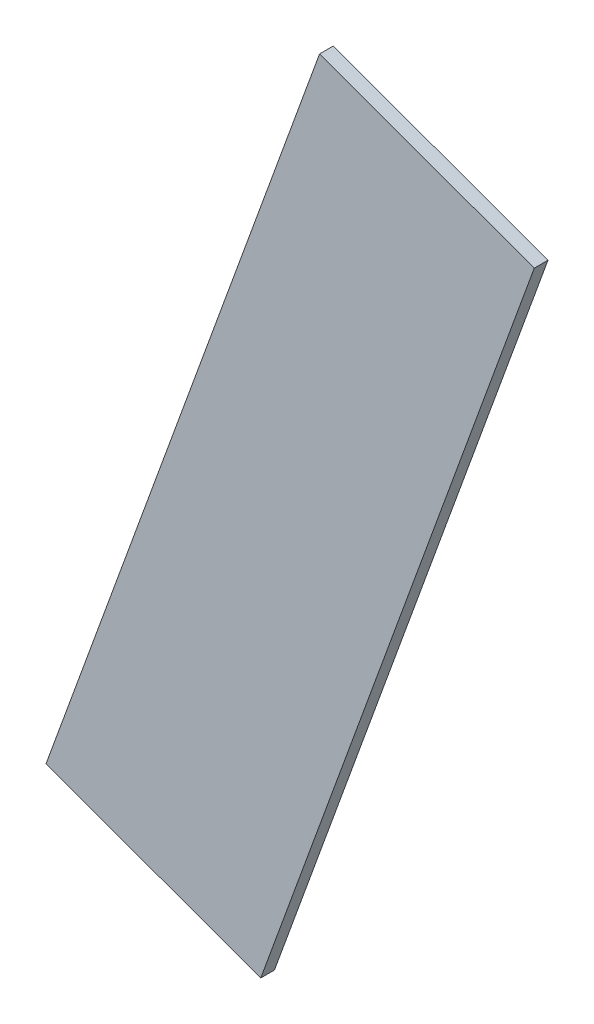
ISO-10303-21;
HEADER;
FILE_DESCRIPTION(('STEP AP214'),'2;1');
FILE_NAME('part.step','',(''),(''),'','','');
FILE_SCHEMA(('AUTOMOTIVE_DESIGN { 1 0 10303 214 1 1 1 1 }'));
ENDSEC;
DATA;
#1=APPLICATION_CONTEXT('core data for automotive mechanical design processes');
#2=APPLICATION_PROTOCOL_DEFINITION('international standard','automotive_design',2000,#1);
#3=PRODUCT_CONTEXT('',#1,'mechanical');
#4=PRODUCT('Part','Part','',(#3));
#5=PRODUCT_RELATED_PRODUCT_CATEGORY('part','',(#4));
#6=PRODUCT_DEFINITION_FORMATION('','',#4);
#7=PRODUCT_DEFINITION_CONTEXT('part definition',#1,'design');
#8=PRODUCT_DEFINITION('design','',#6,#7);
#9=PRODUCT_DEFINITION_SHAPE('','',#8);
#10=(LENGTH_UNIT() NAMED_UNIT(*) SI_UNIT(.MILLI.,.METRE.));
#11=(NAMED_UNIT(*) PLANE_ANGLE_UNIT() SI_UNIT($,.RADIAN.));
#12=(NAMED_UNIT(*) SI_UNIT($,.STERADIAN.) SOLID_ANGLE_UNIT());
#13=UNCERTAINTY_MEASURE_WITH_UNIT(LENGTH_MEASURE(1.E-05),#10,'distance_accuracy_value','');
#14=(GEOMETRIC_REPRESENTATION_CONTEXT(3) GLOBAL_UNCERTAINTY_ASSIGNED_CONTEXT((#13)) GLOBAL_UNIT_ASSIGNED_CONTEXT((#10,
#11,#12)) REPRESENTATION_CONTEXT('',''));
#15=CARTESIAN_POINT('',(0.,0.,0.));
#16=DIRECTION('',(0.,0.,1.));
#17=DIRECTION('',(1.,0.,0.));
#18=AXIS2_PLACEMENT_3D('',#15,#16,#17);
#19=CARTESIAN_POINT('',(366.808331571333,667.065590198311,3.));
#20=DIRECTION('',(0.342020143325665,0.93969262078591,0.));
#21=DIRECTION('',(-0.93969262078591,0.342020143325665,0.));
#22=AXIS2_PLACEMENT_3D('',#19,#20,#21);
#23=PLANE('',#22);
#24=DIRECTION('',(0.93969262078591,-0.342020143325665,0.));
#25=VECTOR('',#24,1.);
#26=CARTESIAN_POINT('',(366.808331571333,667.065590198311,0.));
#27=LINE('',#26,#25);
#28=CARTESIAN_POINT('',(319.823700532038,684.166597364594,0.));
#29=VERTEX_POINT('',#28);
#30=CARTESIAN_POINT('',(366.808331571333,667.065590198311,0.));
#31=VERTEX_POINT('',#30);
#32=EDGE_CURVE('E104',#29,#31,#27,.T.);
#33=ORIENTED_EDGE('',*,*,#32,.T.);
#34=DIRECTION('',(0.,0.,-1.));
#35=VECTOR('',#34,1.);
#36=CARTESIAN_POINT('',(366.808331571333,667.065590198311,3.));
#37=LINE('',#36,#35);
#38=CARTESIAN_POINT('',(366.808331571333,667.065590198311,3.));
#39=VERTEX_POINT('',#38);
#40=EDGE_CURVE('E11',#39,#31,#37,.T.);
#41=ORIENTED_EDGE('',*,*,#40,.F.);
#42=DIRECTION('',(0.93969262078591,-0.342020143325665,0.));
#43=VECTOR('',#42,1.);
#44=CARTESIAN_POINT('',(366.808331571333,667.065590198311,3.));
#45=LINE('',#44,#43);
#46=CARTESIAN_POINT('',(319.823700532038,684.166597364594,3.));
#47=VERTEX_POINT('',#46);
#48=EDGE_CURVE('E92',#47,#39,#45,.T.);
#49=ORIENTED_EDGE('',*,*,#48,.F.);
#50=DIRECTION('',(0.,0.,-1.));
#51=VECTOR('',#50,1.);
#52=CARTESIAN_POINT('',(319.823700532038,684.166597364594,3.));
#53=LINE('',#52,#51);
#54=EDGE_CURVE('E100',#47,#29,#53,.T.);
#55=ORIENTED_EDGE('',*,*,#54,.T.);
#56=EDGE_LOOP('',(#33,#41,#49,#55));
#57=FACE_BOUND('',#56,.T.);
#58=ADVANCED_FACE('F41',(#57),#23,.F.);
#59=CARTESIAN_POINT('',(366.808331571333,667.065590198311,3.));
#60=DIRECTION('',(-0.93969262078591,0.342020143325666,0.));
#61=DIRECTION('',(-0.342020143325666,-0.93969262078591,0.));
#62=AXIS2_PLACEMENT_3D('',#59,#60,#61);
#63=PLANE('',#62);
#64=DIRECTION('',(0.342020143325666,0.939692620785909,0.));
#65=VECTOR('',#64,1.);
#66=CARTESIAN_POINT('',(366.808331571333,667.065590198311,0.));
#67=LINE('',#66,#65);
#68=CARTESIAN_POINT('',(426.661856653324,831.511798835845,0.));
#69=VERTEX_POINT('',#68);
#70=EDGE_CURVE('E96',#31,#69,#67,.T.);
#71=ORIENTED_EDGE('',*,*,#70,.T.);
#72=DIRECTION('',(0.,0.,-1.));
#73=VECTOR('',#72,1.);
#74=CARTESIAN_POINT('',(426.661856653324,831.511798835845,3.));
#75=LINE('',#74,#73);
#76=CARTESIAN_POINT('',(426.661856653324,831.511798835845,3.));
#77=VERTEX_POINT('',#76);
#78=EDGE_CURVE('E49',#77,#69,#75,.T.);
#79=ORIENTED_EDGE('',*,*,#78,.F.);
#80=DIRECTION('',(0.342020143325666,0.939692620785909,0.));
#81=VECTOR('',#80,1.);
#82=CARTESIAN_POINT('',(366.808331571333,667.065590198311,3.));
#83=LINE('',#82,#81);
#84=EDGE_CURVE('E87',#39,#77,#83,.T.);
#85=ORIENTED_EDGE('',*,*,#84,.F.);
#86=ORIENTED_EDGE('',*,*,#40,.T.);
#87=EDGE_LOOP('',(#71,#79,#85,#86));
#88=FACE_BOUND('',#87,.T.);
#89=ADVANCED_FACE('F95',(#88),#63,.F.);
#90=CARTESIAN_POINT('',(426.661856653324,831.511798835845,3.));
#91=DIRECTION('',(-0.342020143325667,-0.939692620785909,0.));
#92=DIRECTION('',(0.939692620785909,-0.342020143325667,0.));
#93=AXIS2_PLACEMENT_3D('',#90,#91,#92);
#94=PLANE('',#93);
#95=DIRECTION('',(-0.939692620785909,0.342020143325667,0.));
#96=VECTOR('',#95,1.);
#97=CARTESIAN_POINT('',(426.661856653324,831.511798835845,0.));
#98=LINE('',#97,#96);
#99=CARTESIAN_POINT('',(379.677225614029,848.612806002129,0.));
#100=VERTEX_POINT('',#99);
#101=EDGE_CURVE('E74',#69,#100,#98,.T.);
#102=ORIENTED_EDGE('',*,*,#101,.T.);
#103=DIRECTION('',(0.,0.,-1.));
#104=VECTOR('',#103,1.);
#105=CARTESIAN_POINT('',(379.677225614029,848.612806002129,3.));
#106=LINE('',#105,#104);
#107=CARTESIAN_POINT('',(379.677225614029,848.612806002129,3.));
#108=VERTEX_POINT('',#107);
#109=EDGE_CURVE('E97',#108,#100,#106,.T.);
#110=ORIENTED_EDGE('',*,*,#109,.F.);
#111=DIRECTION('',(-0.939692620785909,0.342020143325667,0.));
#112=VECTOR('',#111,1.);
#113=CARTESIAN_POINT('',(426.661856653324,831.511798835845,3.));
#114=LINE('',#113,#112);
#115=EDGE_CURVE('E90',#77,#108,#114,.T.);
#116=ORIENTED_EDGE('',*,*,#115,.F.);
#117=ORIENTED_EDGE('',*,*,#78,.T.);
#118=EDGE_LOOP('',(#102,#110,#116,#117));
#119=FACE_BOUND('',#118,.T.);
#120=ADVANCED_FACE('F98',(#119),#94,.F.);
#121=CARTESIAN_POINT('',(319.823700532038,684.166597364594,3.));
#122=DIRECTION('',(0.93969262078591,-0.342020143325665,0.));
#123=DIRECTION('',(0.342020143325665,0.93969262078591,0.));
#124=AXIS2_PLACEMENT_3D('',#121,#122,#123);
#125=PLANE('',#124);
#126=DIRECTION('',(-0.342020143325665,-0.93969262078591,0.));
#127=VECTOR('',#126,1.);
#128=CARTESIAN_POINT('',(319.823700532038,684.166597364594,0.));
#129=LINE('',#128,#127);
#130=EDGE_CURVE('E80',#100,#29,#129,.T.);
#131=ORIENTED_EDGE('',*,*,#130,.T.);
#132=ORIENTED_EDGE('',*,*,#54,.F.);
#133=DIRECTION('',(-0.342020143325665,-0.93969262078591,0.));
#134=VECTOR('',#133,1.);
#135=CARTESIAN_POINT('',(319.823700532038,684.166597364594,3.));
#136=LINE('',#135,#134);
#137=EDGE_CURVE('E57',#108,#47,#136,.T.);
#138=ORIENTED_EDGE('',*,*,#137,.F.);
#139=ORIENTED_EDGE('',*,*,#109,.T.);
#140=EDGE_LOOP('',(#131,#132,#138,#139));
#141=FACE_BOUND('',#140,.T.);
#142=ADVANCED_FACE('F111',(#141),#125,.F.);
#143=CARTESIAN_POINT('',(0.,0.,3.));
#144=DIRECTION('',(0.,0.,-1.));
#145=DIRECTION('',(-1.,0.,0.));
#146=AXIS2_PLACEMENT_3D('',#143,#144,#145);
#147=PLANE('',#146);
#148=ORIENTED_EDGE('',*,*,#48,.T.);
#149=ORIENTED_EDGE('',*,*,#84,.T.);
#150=ORIENTED_EDGE('',*,*,#115,.T.);
#151=ORIENTED_EDGE('',*,*,#137,.T.);
#152=EDGE_LOOP('',(#148,#149,#150,#151));
#153=FACE_BOUND('',#152,.T.);
#154=ADVANCED_FACE('F88',(#153),#147,.F.);
#155=CARTESIAN_POINT('',(0.,0.,0.));
#156=DIRECTION('',(0.,0.,-1.));
#157=DIRECTION('',(-1.,0.,0.));
#158=AXIS2_PLACEMENT_3D('',#155,#156,#157);
#159=PLANE('',#158);
#160=ORIENTED_EDGE('',*,*,#32,.F.);
#161=ORIENTED_EDGE('',*,*,#130,.F.);
#162=ORIENTED_EDGE('',*,*,#101,.F.);
#163=ORIENTED_EDGE('',*,*,#70,.F.);
#164=EDGE_LOOP('',(#160,#161,#162,#163));
#165=FACE_BOUND('',#164,.T.);
#166=ADVANCED_FACE('F114',(#165),#159,.T.);
#167=CLOSED_SHELL('',(#58,#89,#120,#142,#154,#166));
#168=MANIFOLD_SOLID_BREP('B2',#167);
#169=ADVANCED_BREP_SHAPE_REPRESENTATION('',(#18,#168),#14);
#170=SHAPE_DEFINITION_REPRESENTATION(#9,#169);
ENDSEC;
END-ISO-10303-21;
